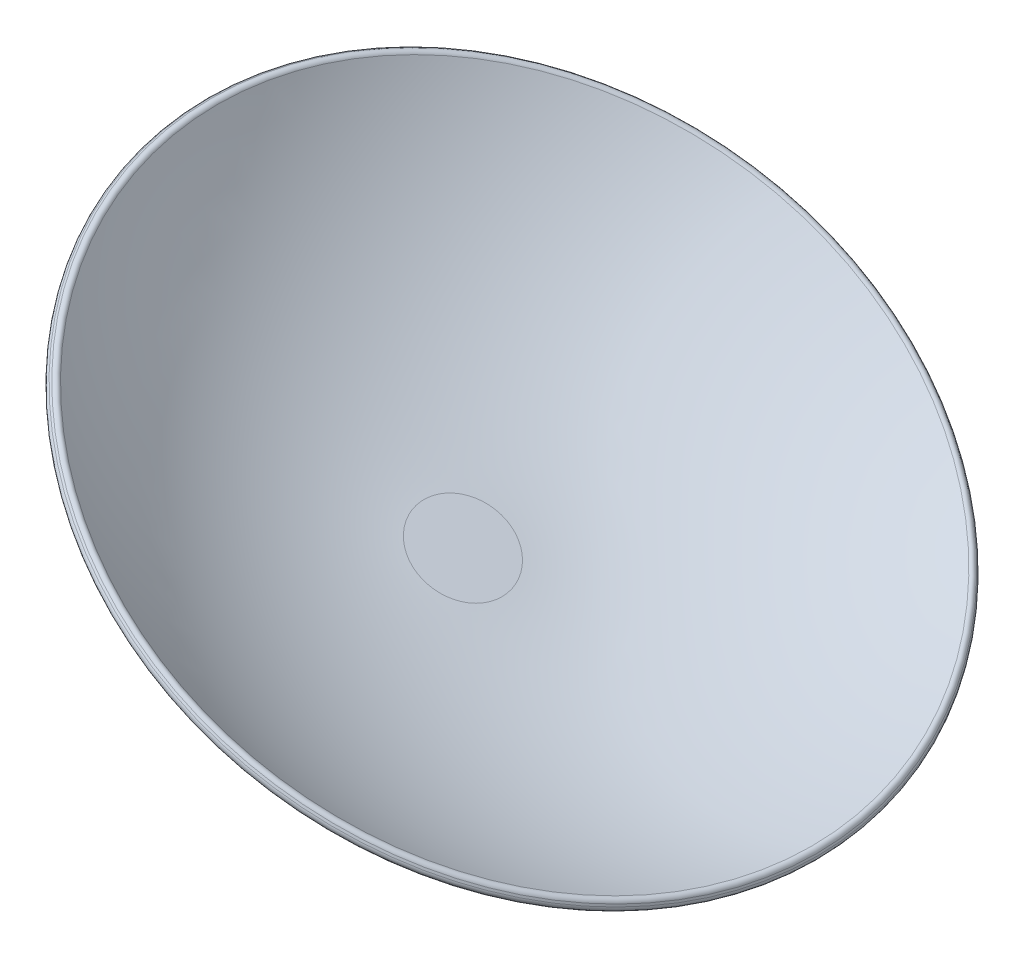
ISO-10303-21;
HEADER;
FILE_DESCRIPTION(('STEP AP214'),'2;1');
FILE_NAME('part.step','',(''),(''),'','','');
FILE_SCHEMA(('AUTOMOTIVE_DESIGN { 1 0 10303 214 1 1 1 1 }'));
ENDSEC;
DATA;
#1=APPLICATION_CONTEXT('core data for automotive mechanical design processes');
#2=APPLICATION_PROTOCOL_DEFINITION('international standard','automotive_design',2000,#1);
#3=PRODUCT_CONTEXT('',#1,'mechanical');
#4=PRODUCT('Part','Part','',(#3));
#5=PRODUCT_RELATED_PRODUCT_CATEGORY('part','',(#4));
#6=PRODUCT_DEFINITION_FORMATION('','',#4);
#7=PRODUCT_DEFINITION_CONTEXT('part definition',#1,'design');
#8=PRODUCT_DEFINITION('design','',#6,#7);
#9=PRODUCT_DEFINITION_SHAPE('','',#8);
#10=(LENGTH_UNIT() NAMED_UNIT(*) SI_UNIT(.MILLI.,.METRE.));
#11=(NAMED_UNIT(*) PLANE_ANGLE_UNIT() SI_UNIT($,.RADIAN.));
#12=(NAMED_UNIT(*) SI_UNIT($,.STERADIAN.) SOLID_ANGLE_UNIT());
#13=UNCERTAINTY_MEASURE_WITH_UNIT(LENGTH_MEASURE(1.E-05),#10,'distance_accuracy_value','');
#14=(GEOMETRIC_REPRESENTATION_CONTEXT(3) GLOBAL_UNCERTAINTY_ASSIGNED_CONTEXT((#13)) GLOBAL_UNIT_ASSIGNED_CONTEXT((#10,
#11,#12)) REPRESENTATION_CONTEXT('',''));
#15=CARTESIAN_POINT('',(0.,0.,0.));
#16=DIRECTION('',(0.,0.,1.));
#17=DIRECTION('',(1.,0.,0.));
#18=AXIS2_PLACEMENT_3D('',#15,#16,#17);
#19=CARTESIAN_POINT('',(0.,0.,0.));
#20=DIRECTION('',(0.,1.,0.));
#21=DIRECTION('',(1.,0.,0.));
#22=AXIS2_PLACEMENT_3D('',#19,#20,#21);
#23=SPHERICAL_SURFACE('',#22,28.575);
#24=CARTESIAN_POINT('',(0.,0.,0.));
#25=DIRECTION('',(-0.499999999999998,-0.86602540378444,0.));
#26=DIRECTION('',(0.86602540378444,-0.499999999999998,0.));
#27=AXIS2_PLACEMENT_3D('',#24,#25,#26);
#28=SPHERICAL_SURFACE('',#27,28.575);
#29=CARTESIAN_POINT('',(13.9302559649849,24.1279110937935,0.));
#30=DIRECTION('',(-0.499999999999998,-0.86602540378444,0.));
#31=DIRECTION('',(0.86602540378444,-0.499999999999998,0.));
#32=AXIS2_PLACEMENT_3D('',#29,#30,#31);
#33=CIRCLE('',#32,6.35);
#34=CARTESIAN_POINT('',(19.4295172790161,20.9529110937935,0.));
#35=VERTEX_POINT('',#34);
#36=EDGE_CURVE('E76',#35,#35,#33,.F.);
#37=ORIENTED_EDGE('',*,*,#36,.F.);
#38=EDGE_LOOP('',(#37));
#39=FACE_BOUND('',#38,.T.);
#40=ADVANCED_FACE('F40',(#39),#28,.T.);
#41=CARTESIAN_POINT('',(29.3293936748328,50.8,0.));
#42=DIRECTION('',(0.499999999999998,0.86602540378444,0.));
#43=DIRECTION('',(-0.86602540378444,0.499999999999998,0.));
#44=AXIS2_PLACEMENT_3D('',#41,#42,#43);
#45=PLANE('',#44);
#46=DIRECTION('',(0.,0.,1.));
#47=VECTOR('',#46,1.);
#48=CARTESIAN_POINT('',(29.3293936748306,50.8000000000013,0.));
#49=LINE('',#48,#47);
#50=CARTESIAN_POINT('',(29.3293936748308,50.8000000000012,-6.35));
#51=VERTEX_POINT('',#50);
#52=CARTESIAN_POINT('',(29.3293936748308,50.8000000000012,6.35));
#53=VERTEX_POINT('',#52);
#54=EDGE_CURVE('E66',#51,#53,#49,.T.);
#55=ORIENTED_EDGE('',*,*,#54,.F.);
#56=CARTESIAN_POINT('',(29.3293936748328,50.8,0.));
#57=DIRECTION('',(0.499999999999998,0.86602540378444,0.));
#58=DIRECTION('',(-0.86602540378444,0.499999999999998,0.));
#59=AXIS2_PLACEMENT_3D('',#56,#57,#58);
#60=CIRCLE('',#59,6.35);
#61=CARTESIAN_POINT('',(23.8301323608016,53.975,0.));
#62=VERTEX_POINT('',#61);
#63=EDGE_CURVE('E61',#51,#62,#60,.T.);
#64=ORIENTED_EDGE('',*,*,#63,.T.);
#65=EDGE_CURVE('E65',#62,#53,#60,.T.);
#66=ORIENTED_EDGE('',*,*,#65,.T.);
#67=EDGE_LOOP('',(#55,#64,#66));
#68=FACE_BOUND('',#67,.T.);
#69=ADVANCED_FACE('F69',(#68),#45,.T.);
#70=CARTESIAN_POINT('',(0.,0.,0.));
#71=DIRECTION('',(0.499999999999998,0.86602540378444,0.));
#72=DIRECTION('',(-0.86602540378444,0.499999999999998,0.));
#73=AXIS2_PLACEMENT_3D('',#70,#71,#72);
#74=CYLINDRICAL_SURFACE('',#73,6.35);
#75=CARTESIAN_POINT('',(29.3293936748328,50.8,0.));
#76=DIRECTION('',(-0.502612250057227,-0.864511958328172,0.));
#77=DIRECTION('',(-0.864511958328172,0.502612250057227,0.));
#78=AXIS2_PLACEMENT_3D('',#75,#76,#77);
#79=ELLIPSE('',#78,6.35002893824872,6.35);
#80=EDGE_CURVE('E55',#53,#51,#79,.F.);
#81=ORIENTED_EDGE('',*,*,#80,.F.);
#82=ORIENTED_EDGE('',*,*,#65,.F.);
#83=ORIENTED_EDGE('',*,*,#63,.F.);
#84=EDGE_LOOP('',(#81,#82,#83));
#85=FACE_BOUND('',#84,.T.);
#86=ORIENTED_EDGE('',*,*,#36,.T.);
#87=EDGE_LOOP('',(#86));
#88=FACE_BOUND('',#87,.T.);
#89=ADVANCED_FACE('F63',(#85,#88),#74,.T.);
#90=CARTESIAN_POINT('',(29.3293936748328,50.8,0.));
#91=DIRECTION('',(-0.502612250057227,-0.864511958328172,0.));
#92=DIRECTION('',(0.864511958328172,-0.502612250057227,0.));
#93=AXIS2_PLACEMENT_3D('',#90,#91,#92);
#94=PLANE('',#93);
#95=ORIENTED_EDGE('',*,*,#80,.T.);
#96=ORIENTED_EDGE('',*,*,#54,.T.);
#97=EDGE_LOOP('',(#95,#96));
#98=FACE_BOUND('',#97,.T.);
#99=CARTESIAN_POINT('',(29.3293936748328,50.8,0.));
#100=DIRECTION('',(-0.502612250057227,-0.864511958328172,0.));
#101=DIRECTION('',(0.864511958328172,-0.502612250057227,0.));
#102=AXIS2_PLACEMENT_3D('',#99,#100,#101);
#103=CIRCLE('',#102,50.8);
#104=CARTESIAN_POINT('',(73.246601157904,25.2672976970929,0.));
#105=VERTEX_POINT('',#104);
#106=EDGE_CURVE('E71',#105,#105,#103,.T.);
#107=ORIENTED_EDGE('',*,*,#106,.T.);
#108=EDGE_LOOP('',(#107));
#109=FACE_BOUND('',#108,.T.);
#110=ADVANCED_FACE('F73',(#98,#109),#94,.T.);
#111=CARTESIAN_POINT('',(310.189119006811,533.889282313782,0.));
#112=DIRECTION('',(-0.502612250057227,-0.864511958328172,0.));
#113=DIRECTION('',(0.864511958328172,-0.502612250057227,0.));
#114=AXIS2_PLACEMENT_3D('',#111,#112,#113);
#115=DEGENERATE_TOROIDAL_SURFACE('',#114,50.7999999999993,558.8,.T.);
#116=CARTESIAN_POINT('',(89.0089716268221,153.45111684325,0.));
#117=DIRECTION('',(0.502612250057227,0.864511958328172,0.));
#118=DIRECTION('',(-0.864511958328172,0.502612250057227,0.));
#119=AXIS2_PLACEMENT_3D('',#116,#117,#118);
#120=CIRCLE('',#119,395.188711572231);
#121=CARTESIAN_POINT('',(-252.636395323674,352.077804363785,0.));
#122=VERTEX_POINT('',#121);
#123=EDGE_CURVE('E75',#122,#122,#120,.F.);
#124=ORIENTED_EDGE('',*,*,#123,.T.);
#125=EDGE_LOOP('',(#124));
#126=FACE_BOUND('',#125,.T.);
#127=ORIENTED_EDGE('',*,*,#106,.F.);
#128=EDGE_LOOP('',(#127));
#129=FACE_BOUND('',#128,.T.);
#130=ADVANCED_FACE('F97',(#126,#129),#115,.T.);
#131=CARTESIAN_POINT('',(90.6062981809458,156.19857854407,0.));
#132=DIRECTION('',(-0.502612250057227,-0.864511958328172,0.));
#133=DIRECTION('',(0.864511958328172,-0.502612250057227,0.));
#134=AXIS2_PLACEMENT_3D('',#131,#132,#133);
#135=CONICAL_SURFACE('',#134,399.21147668252,0.673210729694318);
#136=CARTESIAN_POINT('',(92.6116627506507,159.647880965807,0.));
#137=DIRECTION('',(0.502612250057227,0.864511958328172,0.));
#138=DIRECTION('',(-0.864511958328172,0.502612250057227,0.));
#139=AXIS2_PLACEMENT_3D('',#136,#137,#138);
#140=CIRCLE('',#139,396.02957006346);
#141=CARTESIAN_POINT('',(-249.760636420775,358.697194264599,0.));
#142=VERTEX_POINT('',#141);
#143=EDGE_CURVE('E48',#142,#142,#140,.T.);
#144=ORIENTED_EDGE('',*,*,#143,.T.);
#145=EDGE_LOOP('',(#144));
#146=FACE_BOUND('',#145,.T.);
#147=CARTESIAN_POINT('',(93.6098086821184,161.364729478378,0.));
#148=DIRECTION('',(0.502612250057227,0.864511958328172,0.));
#149=DIRECTION('',(-0.864511958328172,0.502612250057227,0.));
#150=AXIS2_PLACEMENT_3D('',#147,#148,#149);
#151=CIRCLE('',#150,394.445814573758);
#152=CARTESIAN_POINT('',(-247.393314929392,359.61802786695,0.));
#153=VERTEX_POINT('',#152);
#154=EDGE_CURVE('E79',#153,#153,#151,.F.);
#155=ORIENTED_EDGE('',*,*,#154,.T.);
#156=EDGE_LOOP('',(#155));
#157=FACE_BOUND('',#156,.T.);
#158=ADVANCED_FACE('F88',(#146,#157),#135,.T.);
#159=CARTESIAN_POINT('',(310.189119006811,533.889282313782,0.));
#160=DIRECTION('',(-0.502612250057227,-0.864511958328172,0.));
#161=DIRECTION('',(0.864511958328172,-0.502612250057227,0.));
#162=AXIS2_PLACEMENT_3D('',#159,#160,#161);
#163=DEGENERATE_TOROIDAL_SURFACE('',#162,50.7999999999993,546.1,.T.);
#164=CARTESIAN_POINT('',(94.0286413121804,162.085137341866,0.));
#165=DIRECTION('',(0.502612250057227,0.864511958328172,0.));
#166=DIRECTION('',(-0.864511958328172,0.502612250057227,0.));
#167=AXIS2_PLACEMENT_3D('',#164,#165,#166);
#168=CIRCLE('',#167,387.343512290061);
#169=CARTESIAN_POINT('',(-240.834457043413,356.768731599043,0.));
#170=VERTEX_POINT('',#169);
#171=EDGE_CURVE('E12',#170,#170,#168,.T.);
#172=ORIENTED_EDGE('',*,*,#171,.T.);
#173=EDGE_LOOP('',(#172));
#174=FACE_BOUND('',#173,.T.);
#175=CARTESIAN_POINT('',(35.7125692505596,61.7793018707678,0.));
#176=DIRECTION('',(-0.502612250057227,-0.864511958328172,0.));
#177=DIRECTION('',(0.864511958328172,-0.502612250057227,0.));
#178=AXIS2_PLACEMENT_3D('',#175,#176,#177);
#179=CIRCLE('',#178,50.7999999999998);
#180=CARTESIAN_POINT('',(79.6297767336306,36.2465995678608,0.));
#181=VERTEX_POINT('',#180);
#182=EDGE_CURVE('E103',#181,#181,#179,.T.);
#183=ORIENTED_EDGE('',*,*,#182,.T.);
#184=EDGE_LOOP('',(#183));
#185=FACE_BOUND('',#184,.T.);
#186=ADVANCED_FACE('F109',(#174,#185),#163,.F.);
#187=CARTESIAN_POINT('',(35.7125692505596,61.7793018707678,0.));
#188=DIRECTION('',(0.502612250057227,0.864511958328172,0.));
#189=DIRECTION('',(-0.864511958328172,0.502612250057227,0.));
#190=AXIS2_PLACEMENT_3D('',#187,#188,#189);
#191=PLANE('',#190);
#192=ORIENTED_EDGE('',*,*,#182,.F.);
#193=EDGE_LOOP('',(#192));
#194=FACE_BOUND('',#193,.T.);
#195=ADVANCED_FACE('F94',(#194),#191,.T.);
#196=CARTESIAN_POINT('',(91.0197002393674,156.909645620254,0.));
#197=DIRECTION('',(0.502612250057227,0.864511958328172,0.));
#198=DIRECTION('',(-0.864511958328172,0.502612250057227,0.));
#199=AXIS2_PLACEMENT_3D('',#196,#197,#198);
#200=TOROIDAL_SURFACE('',#199,392.057905103392,5.08);
#201=ORIENTED_EDGE('',*,*,#143,.F.);
#202=EDGE_LOOP('',(#201));
#203=FACE_BOUND('',#202,.T.);
#204=ORIENTED_EDGE('',*,*,#123,.F.);
#205=EDGE_LOOP('',(#204));
#206=FACE_BOUND('',#205,.T.);
#207=ADVANCED_FACE('F91',(#203,#206),#200,.T.);
#208=CARTESIAN_POINT('',(92.0178461708351,158.626494132825,0.));
#209=DIRECTION('',(0.502612250057227,0.864511958328172,0.));
#210=DIRECTION('',(-0.864511958328172,0.502612250057227,0.));
#211=AXIS2_PLACEMENT_3D('',#208,#209,#210);
#212=TOROIDAL_SURFACE('',#211,390.474149613689,5.08);
#213=ORIENTED_EDGE('',*,*,#171,.F.);
#214=EDGE_LOOP('',(#213));
#215=FACE_BOUND('',#214,.T.);
#216=ORIENTED_EDGE('',*,*,#154,.F.);
#217=EDGE_LOOP('',(#216));
#218=FACE_BOUND('',#217,.T.);
#219=ADVANCED_FACE('F42',(#215,#218),#212,.T.);
#220=CLOSED_SHELL('',(#40,#69,#89,#110,#130,#158,#186,#195,#207,#219));
#221=MANIFOLD_SOLID_BREP('B2',#220);
#222=ADVANCED_BREP_SHAPE_REPRESENTATION('',(#18,#221),#14);
#223=SHAPE_DEFINITION_REPRESENTATION(#9,#222);
ENDSEC;
END-ISO-10303-21;
